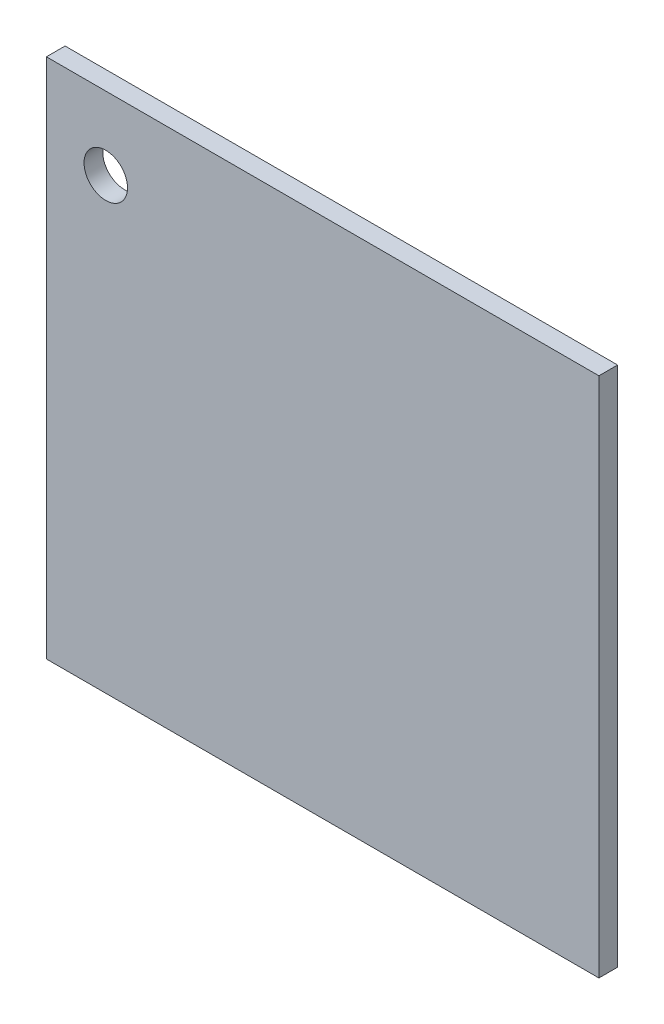
ISO-10303-21;
HEADER;
FILE_DESCRIPTION(('STEP AP214'),'2;1');
FILE_NAME('part.step','',(''),(''),'','','');
FILE_SCHEMA(('AUTOMOTIVE_DESIGN { 1 0 10303 214 1 1 1 1 }'));
ENDSEC;
DATA;
#1=APPLICATION_CONTEXT('core data for automotive mechanical design processes');
#2=APPLICATION_PROTOCOL_DEFINITION('international standard','automotive_design',2000,#1);
#3=PRODUCT_CONTEXT('',#1,'mechanical');
#4=PRODUCT('Part','Part','',(#3));
#5=PRODUCT_RELATED_PRODUCT_CATEGORY('part','',(#4));
#6=PRODUCT_DEFINITION_FORMATION('','',#4);
#7=PRODUCT_DEFINITION_CONTEXT('part definition',#1,'design');
#8=PRODUCT_DEFINITION('design','',#6,#7);
#9=PRODUCT_DEFINITION_SHAPE('','',#8);
#10=(LENGTH_UNIT() NAMED_UNIT(*) SI_UNIT(.MILLI.,.METRE.));
#11=(NAMED_UNIT(*) PLANE_ANGLE_UNIT() SI_UNIT($,.RADIAN.));
#12=(NAMED_UNIT(*) SI_UNIT($,.STERADIAN.) SOLID_ANGLE_UNIT());
#13=UNCERTAINTY_MEASURE_WITH_UNIT(LENGTH_MEASURE(1.E-05),#10,'distance_accuracy_value','');
#14=(GEOMETRIC_REPRESENTATION_CONTEXT(3) GLOBAL_UNCERTAINTY_ASSIGNED_CONTEXT((#13)) GLOBAL_UNIT_ASSIGNED_CONTEXT((#10,
#11,#12)) REPRESENTATION_CONTEXT('',''));
#15=CARTESIAN_POINT('',(0.,0.,0.));
#16=DIRECTION('',(0.,0.,1.));
#17=DIRECTION('',(1.,0.,0.));
#18=AXIS2_PLACEMENT_3D('',#15,#16,#17);
#19=CARTESIAN_POINT('',(65.611477226792,190.846082568407,10.));
#20=DIRECTION('',(-1.,0.,0.));
#21=DIRECTION('',(0.,0.,1.));
#22=AXIS2_PLACEMENT_3D('',#19,#20,#21);
#23=PLANE('',#22);
#24=DIRECTION('',(0.,1.,0.));
#25=VECTOR('',#24,1.);
#26=CARTESIAN_POINT('',(65.611477226792,190.846082568407,0.));
#27=LINE('',#26,#25);
#28=CARTESIAN_POINT('',(65.611477226792,-88.2029748799731,0.));
#29=VERTEX_POINT('',#28);
#30=CARTESIAN_POINT('',(65.611477226792,190.846082568407,0.));
#31=VERTEX_POINT('',#30);
#32=EDGE_CURVE('E102',#29,#31,#27,.T.);
#33=ORIENTED_EDGE('',*,*,#32,.T.);
#34=DIRECTION('',(0.,0.,-1.));
#35=VECTOR('',#34,1.);
#36=CARTESIAN_POINT('',(65.611477226792,190.846082568407,10.));
#37=LINE('',#36,#35);
#38=CARTESIAN_POINT('',(65.611477226792,190.846082568407,10.));
#39=VERTEX_POINT('',#38);
#40=EDGE_CURVE('E11',#39,#31,#37,.T.);
#41=ORIENTED_EDGE('',*,*,#40,.F.);
#42=DIRECTION('',(0.,1.,0.));
#43=VECTOR('',#42,1.);
#44=CARTESIAN_POINT('',(65.611477226792,190.846082568407,10.));
#45=LINE('',#44,#43);
#46=CARTESIAN_POINT('',(65.611477226792,-88.2029748799731,10.));
#47=VERTEX_POINT('',#46);
#48=EDGE_CURVE('E90',#47,#39,#45,.T.);
#49=ORIENTED_EDGE('',*,*,#48,.F.);
#50=DIRECTION('',(0.,0.,-1.));
#51=VECTOR('',#50,1.);
#52=CARTESIAN_POINT('',(65.611477226792,-88.2029748799731,10.));
#53=LINE('',#52,#51);
#54=EDGE_CURVE('E98',#47,#29,#53,.T.);
#55=ORIENTED_EDGE('',*,*,#54,.T.);
#56=EDGE_LOOP('',(#33,#41,#49,#55));
#57=FACE_BOUND('',#56,.T.);
#58=ADVANCED_FACE('F39',(#57),#23,.F.);
#59=CARTESIAN_POINT('',(-230.007348890381,190.846082568407,10.));
#60=DIRECTION('',(0.,-1.,0.));
#61=DIRECTION('',(0.,0.,-1.));
#62=AXIS2_PLACEMENT_3D('',#59,#60,#61);
#63=PLANE('',#62);
#64=DIRECTION('',(-1.,0.,0.));
#65=VECTOR('',#64,1.);
#66=CARTESIAN_POINT('',(-230.007348890381,190.846082568407,0.));
#67=LINE('',#66,#65);
#68=CARTESIAN_POINT('',(-230.007348890381,190.846082568407,0.));
#69=VERTEX_POINT('',#68);
#70=EDGE_CURVE('E94',#31,#69,#67,.T.);
#71=ORIENTED_EDGE('',*,*,#70,.T.);
#72=DIRECTION('',(0.,0.,-1.));
#73=VECTOR('',#72,1.);
#74=CARTESIAN_POINT('',(-230.007348890381,190.846082568407,10.));
#75=LINE('',#74,#73);
#76=CARTESIAN_POINT('',(-230.007348890381,190.846082568407,10.));
#77=VERTEX_POINT('',#76);
#78=EDGE_CURVE('E47',#77,#69,#75,.T.);
#79=ORIENTED_EDGE('',*,*,#78,.F.);
#80=DIRECTION('',(-1.,0.,0.));
#81=VECTOR('',#80,1.);
#82=CARTESIAN_POINT('',(-230.007348890381,190.846082568407,10.));
#83=LINE('',#82,#81);
#84=EDGE_CURVE('E85',#39,#77,#83,.T.);
#85=ORIENTED_EDGE('',*,*,#84,.F.);
#86=ORIENTED_EDGE('',*,*,#40,.T.);
#87=EDGE_LOOP('',(#71,#79,#85,#86));
#88=FACE_BOUND('',#87,.T.);
#89=ADVANCED_FACE('F93',(#88),#63,.F.);
#90=CARTESIAN_POINT('',(-230.007348890381,190.846082568407,10.));
#91=DIRECTION('',(1.,0.,0.));
#92=DIRECTION('',(0.,0.,-1.));
#93=AXIS2_PLACEMENT_3D('',#90,#91,#92);
#94=PLANE('',#93);
#95=DIRECTION('',(0.,-1.,0.));
#96=VECTOR('',#95,1.);
#97=CARTESIAN_POINT('',(-230.007348890381,190.846082568407,0.));
#98=LINE('',#97,#96);
#99=CARTESIAN_POINT('',(-230.007348890381,-88.2029748799731,0.));
#100=VERTEX_POINT('',#99);
#101=EDGE_CURVE('E72',#69,#100,#98,.T.);
#102=ORIENTED_EDGE('',*,*,#101,.T.);
#103=DIRECTION('',(0.,0.,-1.));
#104=VECTOR('',#103,1.);
#105=CARTESIAN_POINT('',(-230.007348890381,-88.2029748799731,10.));
#106=LINE('',#105,#104);
#107=CARTESIAN_POINT('',(-230.007348890381,-88.2029748799731,10.));
#108=VERTEX_POINT('',#107);
#109=EDGE_CURVE('E95',#108,#100,#106,.T.);
#110=ORIENTED_EDGE('',*,*,#109,.F.);
#111=DIRECTION('',(0.,-1.,0.));
#112=VECTOR('',#111,1.);
#113=CARTESIAN_POINT('',(-230.007348890381,190.846082568407,10.));
#114=LINE('',#113,#112);
#115=EDGE_CURVE('E88',#77,#108,#114,.T.);
#116=ORIENTED_EDGE('',*,*,#115,.F.);
#117=ORIENTED_EDGE('',*,*,#78,.T.);
#118=EDGE_LOOP('',(#102,#110,#116,#117));
#119=FACE_BOUND('',#118,.T.);
#120=ADVANCED_FACE('F96',(#119),#94,.F.);
#121=CARTESIAN_POINT('',(-230.007348890381,-88.2029748799731,10.));
#122=DIRECTION('',(0.,1.,0.));
#123=DIRECTION('',(0.,0.,1.));
#124=AXIS2_PLACEMENT_3D('',#121,#122,#123);
#125=PLANE('',#124);
#126=DIRECTION('',(1.,0.,0.));
#127=VECTOR('',#126,1.);
#128=CARTESIAN_POINT('',(-230.007348890381,-88.2029748799731,0.));
#129=LINE('',#128,#127);
#130=EDGE_CURVE('E78',#100,#29,#129,.T.);
#131=ORIENTED_EDGE('',*,*,#130,.T.);
#132=ORIENTED_EDGE('',*,*,#54,.F.);
#133=DIRECTION('',(1.,0.,0.));
#134=VECTOR('',#133,1.);
#135=CARTESIAN_POINT('',(-230.007348890381,-88.2029748799731,10.));
#136=LINE('',#135,#134);
#137=EDGE_CURVE('E55',#108,#47,#136,.T.);
#138=ORIENTED_EDGE('',*,*,#137,.F.);
#139=ORIENTED_EDGE('',*,*,#109,.T.);
#140=EDGE_LOOP('',(#131,#132,#138,#139));
#141=FACE_BOUND('',#140,.T.);
#142=ADVANCED_FACE('F110',(#141),#125,.F.);
#143=CARTESIAN_POINT('',(0.,0.,10.));
#144=DIRECTION('',(0.,0.,1.));
#145=DIRECTION('',(1.,0.,0.));
#146=AXIS2_PLACEMENT_3D('',#143,#144,#145);
#147=PLANE('',#146);
#148=CARTESIAN_POINT('',(-198.24521734443,151.789338010922,10.));
#149=DIRECTION('',(0.,0.,1.));
#150=DIRECTION('',(1.,0.,0.));
#151=AXIS2_PLACEMENT_3D('',#148,#149,#150);
#152=CIRCLE('',#151,11.6328669433977);
#153=CARTESIAN_POINT('',(-186.612350401032,151.789338010922,10.));
#154=VERTEX_POINT('',#153);
#155=EDGE_CURVE('E116',#154,#154,#152,.T.);
#156=ORIENTED_EDGE('',*,*,#155,.F.);
#157=EDGE_LOOP('',(#156));
#158=FACE_BOUND('',#157,.T.);
#159=ORIENTED_EDGE('',*,*,#48,.T.);
#160=ORIENTED_EDGE('',*,*,#84,.T.);
#161=ORIENTED_EDGE('',*,*,#115,.T.);
#162=ORIENTED_EDGE('',*,*,#137,.T.);
#163=EDGE_LOOP('',(#159,#160,#161,#162));
#164=FACE_BOUND('',#163,.T.);
#165=ADVANCED_FACE('F86',(#158,#164),#147,.T.);
#166=CARTESIAN_POINT('',(0.,0.,0.));
#167=DIRECTION('',(0.,0.,1.));
#168=DIRECTION('',(1.,0.,0.));
#169=AXIS2_PLACEMENT_3D('',#166,#167,#168);
#170=PLANE('',#169);
#171=CARTESIAN_POINT('',(-198.24521734443,151.789338010922,0.));
#172=DIRECTION('',(0.,0.,1.));
#173=DIRECTION('',(1.,0.,0.));
#174=AXIS2_PLACEMENT_3D('',#171,#172,#173);
#175=CIRCLE('',#174,11.6328669433977);
#176=CARTESIAN_POINT('',(-186.612350401032,151.789338010922,0.));
#177=VERTEX_POINT('',#176);
#178=EDGE_CURVE('E105',#177,#177,#175,.T.);
#179=ORIENTED_EDGE('',*,*,#178,.T.);
#180=EDGE_LOOP('',(#179));
#181=FACE_BOUND('',#180,.T.);
#182=ORIENTED_EDGE('',*,*,#32,.F.);
#183=ORIENTED_EDGE('',*,*,#130,.F.);
#184=ORIENTED_EDGE('',*,*,#101,.F.);
#185=ORIENTED_EDGE('',*,*,#70,.F.);
#186=EDGE_LOOP('',(#182,#183,#184,#185));
#187=FACE_BOUND('',#186,.T.);
#188=ADVANCED_FACE('F113',(#181,#187),#170,.F.);
#189=CARTESIAN_POINT('',(-198.24521734443,151.789338010922,0.));
#190=DIRECTION('',(0.,0.,1.));
#191=DIRECTION('',(1.,0.,0.));
#192=AXIS2_PLACEMENT_3D('',#189,#190,#191);
#193=CYLINDRICAL_SURFACE('',#192,11.6328669433977);
#194=ORIENTED_EDGE('',*,*,#178,.F.);
#195=EDGE_LOOP('',(#194));
#196=FACE_BOUND('',#195,.T.);
#197=ORIENTED_EDGE('',*,*,#155,.T.);
#198=EDGE_LOOP('',(#197));
#199=FACE_BOUND('',#198,.T.);
#200=ADVANCED_FACE('F123',(#196,#199),#193,.F.);
#201=CLOSED_SHELL('',(#58,#89,#120,#142,#165,#188,#200));
#202=MANIFOLD_SOLID_BREP('B2',#201);
#203=ADVANCED_BREP_SHAPE_REPRESENTATION('',(#18,#202),#14);
#204=SHAPE_DEFINITION_REPRESENTATION(#9,#203);
ENDSEC;
END-ISO-10303-21;
